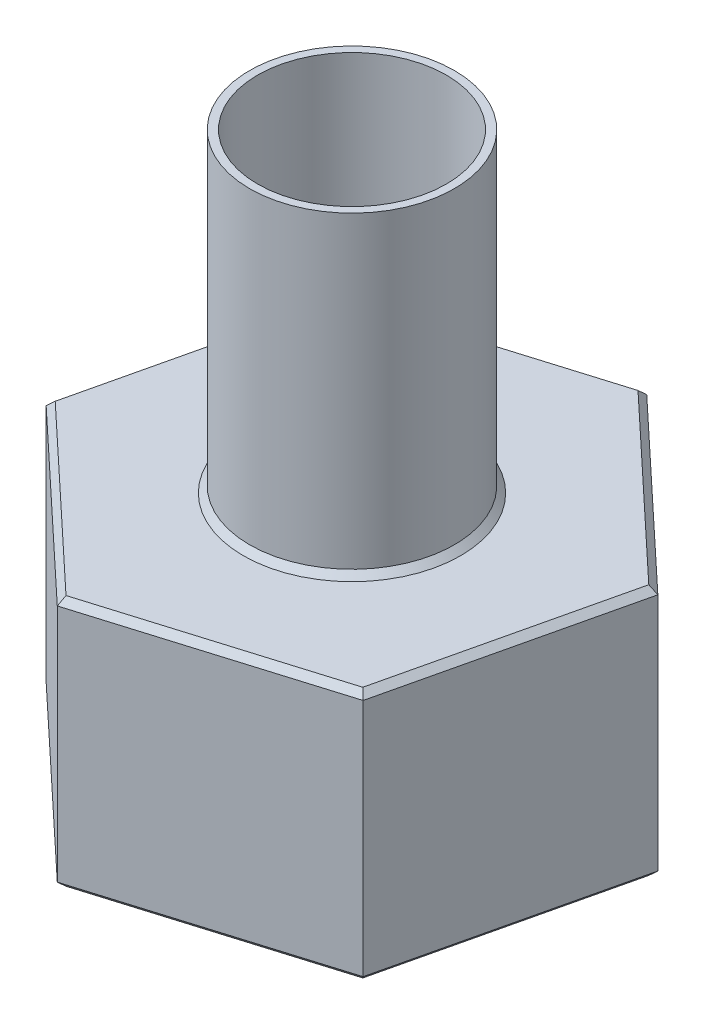
ISO-10303-21;
HEADER;
FILE_DESCRIPTION(('STEP AP214'),'2;1');
FILE_NAME('part.step','',(''),(''),'','','');
FILE_SCHEMA(('AUTOMOTIVE_DESIGN { 1 0 10303 214 1 1 1 1 }'));
ENDSEC;
DATA;
#1=APPLICATION_CONTEXT('core data for automotive mechanical design processes');
#2=APPLICATION_PROTOCOL_DEFINITION('international standard','automotive_design',2000,#1);
#3=PRODUCT_CONTEXT('',#1,'mechanical');
#4=PRODUCT('Part','Part','',(#3));
#5=PRODUCT_RELATED_PRODUCT_CATEGORY('part','',(#4));
#6=PRODUCT_DEFINITION_FORMATION('','',#4);
#7=PRODUCT_DEFINITION_CONTEXT('part definition',#1,'design');
#8=PRODUCT_DEFINITION('design','',#6,#7);
#9=PRODUCT_DEFINITION_SHAPE('','',#8);
#10=(LENGTH_UNIT() NAMED_UNIT(*) SI_UNIT(.MILLI.,.METRE.));
#11=(NAMED_UNIT(*) PLANE_ANGLE_UNIT() SI_UNIT($,.RADIAN.));
#12=(NAMED_UNIT(*) SI_UNIT($,.STERADIAN.) SOLID_ANGLE_UNIT());
#13=UNCERTAINTY_MEASURE_WITH_UNIT(LENGTH_MEASURE(1.E-05),#10,'distance_accuracy_value','');
#14=(GEOMETRIC_REPRESENTATION_CONTEXT(3) GLOBAL_UNCERTAINTY_ASSIGNED_CONTEXT((#13)) GLOBAL_UNIT_ASSIGNED_CONTEXT((#10,
#11,#12)) REPRESENTATION_CONTEXT('',''));
#15=CARTESIAN_POINT('',(0.,0.,0.));
#16=DIRECTION('',(0.,0.,1.));
#17=DIRECTION('',(1.,0.,0.));
#18=AXIS2_PLACEMENT_3D('',#15,#16,#17);
#19=CARTESIAN_POINT('',(0.,18.513068084755,0.));
#20=DIRECTION('',(0.,-1.,0.));
#21=DIRECTION('',(0.,0.,-1.));
#22=AXIS2_PLACEMENT_3D('',#19,#20,#21);
#23=CYLINDRICAL_SURFACE('',#22,5.54214814568497);
#24=CARTESIAN_POINT('',(0.,1.81677179587929,0.));
#25=DIRECTION('',(0.,-1.,0.));
#26=DIRECTION('',(0.,0.,-1.));
#27=AXIS2_PLACEMENT_3D('',#24,#25,#26);
#28=CIRCLE('',#27,5.54214814568497);
#29=CARTESIAN_POINT('',(0.,1.81677179587929,-5.54214814568497));
#30=VERTEX_POINT('',#29);
#31=EDGE_CURVE('E206',#30,#30,#28,.F.);
#32=ORIENTED_EDGE('',*,*,#31,.T.);
#33=EDGE_LOOP('',(#32));
#34=FACE_BOUND('',#33,.T.);
#35=CARTESIAN_POINT('',(0.,18.513068084755,0.));
#36=DIRECTION('',(0.,1.,0.));
#37=DIRECTION('',(0.,0.,1.));
#38=AXIS2_PLACEMENT_3D('',#35,#36,#37);
#39=CIRCLE('',#38,5.54214814568497);
#40=CARTESIAN_POINT('',(0.,18.513068084755,5.54214814568497));
#41=VERTEX_POINT('',#40);
#42=EDGE_CURVE('E165',#41,#41,#39,.T.);
#43=ORIENTED_EDGE('',*,*,#42,.F.);
#44=EDGE_LOOP('',(#43));
#45=FACE_BOUND('',#44,.T.);
#46=ADVANCED_FACE('F40',(#34,#45),#23,.T.);
#47=CARTESIAN_POINT('',(0.,18.513068084755,0.));
#48=DIRECTION('',(0.,1.,0.));
#49=DIRECTION('',(0.,0.,1.));
#50=AXIS2_PLACEMENT_3D('',#47,#48,#49);
#51=PLANE('',#50);
#52=CARTESIAN_POINT('',(0.,18.513068084755,0.));
#53=DIRECTION('',(0.,-1.,0.));
#54=DIRECTION('',(0.,0.,-1.));
#55=AXIS2_PLACEMENT_3D('',#52,#53,#54);
#56=CIRCLE('',#55,5.11111110883951);
#57=CARTESIAN_POINT('',(0.,18.513068084755,-5.11111110883951));
#58=VERTEX_POINT('',#57);
#59=EDGE_CURVE('E170',#58,#58,#56,.T.);
#60=ORIENTED_EDGE('',*,*,#59,.T.);
#61=EDGE_LOOP('',(#60));
#62=FACE_BOUND('',#61,.T.);
#63=ORIENTED_EDGE('',*,*,#42,.T.);
#64=EDGE_LOOP('',(#63));
#65=FACE_BOUND('',#64,.T.);
#66=ADVANCED_FACE('F293',(#62,#65),#51,.T.);
#67=CARTESIAN_POINT('',(0.,18.513068084755,0.));
#68=DIRECTION('',(0.,-1.,0.));
#69=DIRECTION('',(0.,0.,-1.));
#70=AXIS2_PLACEMENT_3D('',#67,#68,#69);
#71=CYLINDRICAL_SURFACE('',#70,5.11111110883951);
#72=ORIENTED_EDGE('',*,*,#59,.F.);
#73=EDGE_LOOP('',(#72));
#74=FACE_BOUND('',#73,.T.);
#75=CARTESIAN_POINT('',(0.,1.47603105529,0.));
#76=DIRECTION('',(0.,-1.,0.));
#77=DIRECTION('',(0.,0.,-1.));
#78=AXIS2_PLACEMENT_3D('',#75,#76,#77);
#79=CIRCLE('',#78,5.11111110883951);
#80=CARTESIAN_POINT('',(0.,1.47603105529,-5.11111110883951));
#81=VERTEX_POINT('',#80);
#82=EDGE_CURVE('E265',#81,#81,#79,.T.);
#83=ORIENTED_EDGE('',*,*,#82,.T.);
#84=EDGE_LOOP('',(#83));
#85=FACE_BOUND('',#84,.T.);
#86=ADVANCED_FACE('F270',(#74,#85),#71,.F.);
#87=CARTESIAN_POINT('',(0.,1.47603105529,0.));
#88=DIRECTION('',(0.,-1.,0.));
#89=DIRECTION('',(0.,0.,-1.));
#90=AXIS2_PLACEMENT_3D('',#87,#88,#89);
#91=PLANE('',#90);
#92=DIRECTION('',(0.227681487376882,0.,-0.973735662439171));
#93=VECTOR('',#92,1.);
#94=CARTESIAN_POINT('',(10.8661687023159,1.47603105529,2.54075674504318));
#95=LINE('',#94,#93);
#96=CARTESIAN_POINT('',(9.39926211161985,1.47603105529,8.81434217038515));
#97=VERTEX_POINT('',#96);
#98=CARTESIAN_POINT('',(12.3330752930119,1.47603105529,-3.73282868029879));
#99=VERTEX_POINT('',#98);
#100=EDGE_CURVE('E184',#97,#99,#95,.T.);
#101=ORIENTED_EDGE('',*,*,#100,.T.);
#102=DIRECTION('',(-0.729439076554749,0.,-0.684045783259392));
#103=VECTOR('',#102,1.);
#104=CARTESIAN_POINT('',(7.633444237202,1.47603105529,-8.13999976549136));
#105=LINE('',#104,#103);
#106=CARTESIAN_POINT('',(2.93381318139207,1.47603105529,-12.5471708506839));
#107=VERTEX_POINT('',#106);
#108=EDGE_CURVE('E143',#99,#107,#105,.T.);
#109=ORIENTED_EDGE('',*,*,#108,.T.);
#110=DIRECTION('',(-0.957120563931632,0.,0.289689879179779));
#111=VECTOR('',#110,1.);
#112=CARTESIAN_POINT('',(-3.23272446511389,1.47603105529,-10.6807565105345));
#113=LINE('',#112,#111);
#114=CARTESIAN_POINT('',(-9.39926211161985,1.47603105529,-8.81434217038514));
#115=VERTEX_POINT('',#114);
#116=EDGE_CURVE('E176',#107,#115,#113,.T.);
#117=ORIENTED_EDGE('',*,*,#116,.T.);
#118=DIRECTION('',(-0.227681487376882,0.,0.973735662439171));
#119=VECTOR('',#118,1.);
#120=CARTESIAN_POINT('',(-10.8661687023159,1.47603105529,-2.54075674504318));
#121=LINE('',#120,#119);
#122=CARTESIAN_POINT('',(-12.3330752930119,1.47603105529,3.73282868029878));
#123=VERTEX_POINT('',#122);
#124=EDGE_CURVE('E178',#115,#123,#121,.T.);
#125=ORIENTED_EDGE('',*,*,#124,.T.);
#126=DIRECTION('',(0.729439076554749,0.,0.684045783259392));
#127=VECTOR('',#126,1.);
#128=CARTESIAN_POINT('',(-7.633444237202,1.47603105529,8.13999976549136));
#129=LINE('',#128,#127);
#130=CARTESIAN_POINT('',(-2.93381318139207,1.47603105529,12.5471708506839));
#131=VERTEX_POINT('',#130);
#132=EDGE_CURVE('E180',#123,#131,#129,.T.);
#133=ORIENTED_EDGE('',*,*,#132,.T.);
#134=DIRECTION('',(0.957120563931632,0.,-0.289689879179779));
#135=VECTOR('',#134,1.);
#136=CARTESIAN_POINT('',(3.23272446511389,1.47603105529,10.6807565105345));
#137=LINE('',#136,#135);
#138=EDGE_CURVE('E182',#131,#97,#137,.T.);
#139=ORIENTED_EDGE('',*,*,#138,.T.);
#140=EDGE_LOOP('',(#101,#109,#117,#125,#133,#139));
#141=FACE_BOUND('',#140,.T.);
#142=CARTESIAN_POINT('',(0.,1.47603105529,0.));
#143=DIRECTION('',(0.,-1.,0.));
#144=DIRECTION('',(0.,0.,-1.));
#145=AXIS2_PLACEMENT_3D('',#142,#143,#144);
#146=CIRCLE('',#145,5.88288888627426);
#147=CARTESIAN_POINT('',(0.,1.47603105529,-5.88288888627426));
#148=VERTEX_POINT('',#147);
#149=EDGE_CURVE('E167',#148,#148,#146,.T.);
#150=ORIENTED_EDGE('',*,*,#149,.T.);
#151=EDGE_LOOP('',(#150));
#152=FACE_BOUND('',#151,.T.);
#153=ADVANCED_FACE('F277',(#141,#152),#91,.F.);
#154=CARTESIAN_POINT('',(0.,-12.153598568282,0.));
#155=DIRECTION('',(0.,-1.,0.));
#156=DIRECTION('',(0.,0.,-1.));
#157=AXIS2_PLACEMENT_3D('',#154,#155,#156);
#158=PLANE('',#157);
#159=CARTESIAN_POINT('',(0.,-12.153598568282,0.));
#160=DIRECTION('',(0.,-1.,0.));
#161=DIRECTION('',(0.,0.,-1.));
#162=AXIS2_PLACEMENT_3D('',#159,#160,#161);
#163=CIRCLE('',#162,10.8185185137103);
#164=CARTESIAN_POINT('',(0.,-12.153598568282,-10.8185185137103));
#165=VERTEX_POINT('',#164);
#166=EDGE_CURVE('E475',#165,#165,#163,.T.);
#167=ORIENTED_EDGE('',*,*,#166,.F.);
#168=EDGE_LOOP('',(#167));
#169=FACE_BOUND('',#168,.T.);
#170=DIRECTION('',(0.227681487376882,0.,-0.973735662439171));
#171=VECTOR('',#170,1.);
#172=CARTESIAN_POINT('',(-9.35447107068257,-12.153598568282,-9.00590203070093));
#173=LINE('',#172,#171);
#174=CARTESIAN_POINT('',(-12.3330752930119,-12.153598568282,3.73282868029878));
#175=VERTEX_POINT('',#174);
#176=CARTESIAN_POINT('',(-9.39926211161985,-12.153598568282,-8.81434217038514));
#177=VERTEX_POINT('',#176);
#178=EDGE_CURVE('E209',#175,#177,#173,.T.);
#179=ORIENTED_EDGE('',*,*,#178,.T.);
#180=DIRECTION('',(0.957120563931632,0.,-0.289689879179779));
#181=VECTOR('',#180,1.);
#182=CARTESIAN_POINT('',(3.12210440723958,-12.153598568282,-12.6041606015282));
#183=LINE('',#182,#181);
#184=CARTESIAN_POINT('',(2.93381318139207,-12.153598568282,-12.5471708506839));
#185=VERTEX_POINT('',#184);
#186=EDGE_CURVE('E11',#177,#185,#183,.T.);
#187=ORIENTED_EDGE('',*,*,#186,.T.);
#188=DIRECTION('',(0.729439076554749,0.,0.684045783259392));
#189=VECTOR('',#188,1.);
#190=CARTESIAN_POINT('',(12.4765754779221,-12.153598568282,-3.59825857082726));
#191=LINE('',#190,#189);
#192=CARTESIAN_POINT('',(12.3330752930119,-12.153598568282,-3.73282868029879));
#193=VERTEX_POINT('',#192);
#194=EDGE_CURVE('E49',#185,#193,#191,.T.);
#195=ORIENTED_EDGE('',*,*,#194,.T.);
#196=DIRECTION('',(-0.227681487376882,0.,0.973735662439171));
#197=VECTOR('',#196,1.);
#198=CARTESIAN_POINT('',(9.35447107068257,-12.153598568282,9.00590203070093));
#199=LINE('',#198,#197);
#200=CARTESIAN_POINT('',(9.39926211161985,-12.153598568282,8.81434217038514));
#201=VERTEX_POINT('',#200);
#202=EDGE_CURVE('E159',#193,#201,#199,.T.);
#203=ORIENTED_EDGE('',*,*,#202,.T.);
#204=DIRECTION('',(-0.957120563931632,0.,0.289689879179779));
#205=VECTOR('',#204,1.);
#206=CARTESIAN_POINT('',(-3.12210440723958,-12.153598568282,12.6041606015282));
#207=LINE('',#206,#205);
#208=CARTESIAN_POINT('',(-2.93381318139207,-12.153598568282,12.5471708506839));
#209=VERTEX_POINT('',#208);
#210=EDGE_CURVE('E213',#201,#209,#207,.T.);
#211=ORIENTED_EDGE('',*,*,#210,.T.);
#212=DIRECTION('',(-0.729439076554749,0.,-0.684045783259392));
#213=VECTOR('',#212,1.);
#214=CARTESIAN_POINT('',(-12.4765754779221,-12.153598568282,3.59825857082726));
#215=LINE('',#214,#213);
#216=EDGE_CURVE('E211',#209,#175,#215,.T.);
#217=ORIENTED_EDGE('',*,*,#216,.T.);
#218=EDGE_LOOP('',(#179,#187,#195,#203,#211,#217));
#219=FACE_BOUND('',#218,.T.);
#220=ADVANCED_FACE('F290',(#169,#219),#158,.T.);
#221=CARTESIAN_POINT('',(-12.7096577447069,-12.153598568282,3.8468081819873));
#222=DIRECTION('',(0.973735662439171,0.,0.227681487376882));
#223=DIRECTION('',(0.227681487376882,0.,-0.973735662439171));
#224=AXIS2_PLACEMENT_3D('',#221,#222,#223);
#225=PLANE('',#224);
#226=DIRECTION('',(0.,1.,0.));
#227=VECTOR('',#226,1.);
#228=CARTESIAN_POINT('',(-12.7096577447069,-12.153598568282,3.8468081819873));
#229=LINE('',#228,#227);
#230=CARTESIAN_POINT('',(-12.7096577447069,-11.8128578276927,3.8468081819873));
#231=VERTEX_POINT('',#230);
#232=CARTESIAN_POINT('',(-12.7096577447069,1.1352903147007,3.8468081819873));
#233=VERTEX_POINT('',#232);
#234=EDGE_CURVE('E257',#231,#233,#229,.T.);
#235=ORIENTED_EDGE('',*,*,#234,.T.);
#236=DIRECTION('',(0.227681487376882,0.,-0.973735662439171));
#237=VECTOR('',#236,1.);
#238=CARTESIAN_POINT('',(-12.7096577447069,1.1352903147007,3.8468081819873));
#239=LINE('',#238,#237);
#240=CARTESIAN_POINT('',(-9.6862624814403,1.1352903147007,-9.0834823893282));
#241=VERTEX_POINT('',#240);
#242=EDGE_CURVE('E199',#233,#241,#239,.T.);
#243=ORIENTED_EDGE('',*,*,#242,.T.);
#244=DIRECTION('',(0.,1.,0.));
#245=VECTOR('',#244,1.);
#246=CARTESIAN_POINT('',(-9.6862624814403,-12.153598568282,-9.0834823893282));
#247=LINE('',#246,#245);
#248=CARTESIAN_POINT('',(-9.6862624814403,-11.8128578276927,-9.0834823893282));
#249=VERTEX_POINT('',#248);
#250=EDGE_CURVE('E233',#249,#241,#247,.T.);
#251=ORIENTED_EDGE('',*,*,#250,.F.);
#252=DIRECTION('',(-0.227681487376882,0.,0.973735662439171));
#253=VECTOR('',#252,1.);
#254=CARTESIAN_POINT('',(-12.7096577447069,-11.8128578276927,3.8468081819873));
#255=LINE('',#254,#253);
#256=EDGE_CURVE('E197',#249,#231,#255,.T.);
#257=ORIENTED_EDGE('',*,*,#256,.T.);
#258=EDGE_LOOP('',(#235,#243,#251,#257));
#259=FACE_BOUND('',#258,.T.);
#260=ADVANCED_FACE('F416',(#259),#225,.F.);
#261=CARTESIAN_POINT('',(-3.02339526326664,-12.153598568282,12.9302905713155));
#262=DIRECTION('',(0.684045783259392,0.,-0.729439076554749));
#263=DIRECTION('',(-0.729439076554749,0.,-0.684045783259392));
#264=AXIS2_PLACEMENT_3D('',#261,#262,#263);
#265=PLANE('',#264);
#266=DIRECTION('',(0.,1.,0.));
#267=VECTOR('',#266,1.);
#268=CARTESIAN_POINT('',(-3.02339526326664,-12.153598568282,12.9302905713155));
#269=LINE('',#268,#267);
#270=CARTESIAN_POINT('',(-3.02339526326664,-11.8128578276927,12.9302905713155));
#271=VERTEX_POINT('',#270);
#272=CARTESIAN_POINT('',(-3.02339526326664,1.1352903147007,12.9302905713155));
#273=VERTEX_POINT('',#272);
#274=EDGE_CURVE('E254',#271,#273,#269,.T.);
#275=ORIENTED_EDGE('',*,*,#274,.T.);
#276=DIRECTION('',(-0.729439076554749,0.,-0.684045783259392));
#277=VECTOR('',#276,1.);
#278=CARTESIAN_POINT('',(-3.02339526326664,1.1352903147007,12.9302905713155));
#279=LINE('',#278,#277);
#280=EDGE_CURVE('E195',#273,#233,#279,.T.);
#281=ORIENTED_EDGE('',*,*,#280,.T.);
#282=ORIENTED_EDGE('',*,*,#234,.F.);
#283=DIRECTION('',(0.729439076554749,0.,0.684045783259392));
#284=VECTOR('',#283,1.);
#285=CARTESIAN_POINT('',(-3.02339526326664,-11.8128578276927,12.9302905713155));
#286=LINE('',#285,#284);
#287=EDGE_CURVE('E193',#231,#271,#286,.T.);
#288=ORIENTED_EDGE('',*,*,#287,.T.);
#289=EDGE_LOOP('',(#275,#281,#282,#288));
#290=FACE_BOUND('',#289,.T.);
#291=ADVANCED_FACE('F407',(#290),#265,.F.);
#292=CARTESIAN_POINT('',(9.6862624814403,-12.153598568282,9.0834823893282));
#293=DIRECTION('',(-0.289689879179779,0.,-0.957120563931632));
#294=DIRECTION('',(-0.957120563931632,0.,0.289689879179779));
#295=AXIS2_PLACEMENT_3D('',#292,#293,#294);
#296=PLANE('',#295);
#297=DIRECTION('',(0.,1.,0.));
#298=VECTOR('',#297,1.);
#299=CARTESIAN_POINT('',(9.6862624814403,-12.153598568282,9.0834823893282));
#300=LINE('',#299,#298);
#301=CARTESIAN_POINT('',(9.6862624814403,-11.8128578276927,9.0834823893282));
#302=VERTEX_POINT('',#301);
#303=CARTESIAN_POINT('',(9.6862624814403,1.1352903147007,9.0834823893282));
#304=VERTEX_POINT('',#303);
#305=EDGE_CURVE('E137',#302,#304,#300,.T.);
#306=ORIENTED_EDGE('',*,*,#305,.T.);
#307=DIRECTION('',(-0.957120563931632,0.,0.289689879179779));
#308=VECTOR('',#307,1.);
#309=CARTESIAN_POINT('',(9.6862624814403,1.1352903147007,9.0834823893282));
#310=LINE('',#309,#308);
#311=EDGE_CURVE('E191',#304,#273,#310,.T.);
#312=ORIENTED_EDGE('',*,*,#311,.T.);
#313=ORIENTED_EDGE('',*,*,#274,.F.);
#314=DIRECTION('',(0.957120563931632,0.,-0.289689879179779));
#315=VECTOR('',#314,1.);
#316=CARTESIAN_POINT('',(9.6862624814403,-11.8128578276927,9.0834823893282));
#317=LINE('',#316,#315);
#318=EDGE_CURVE('E189',#271,#302,#317,.T.);
#319=ORIENTED_EDGE('',*,*,#318,.T.);
#320=EDGE_LOOP('',(#306,#312,#313,#319));
#321=FACE_BOUND('',#320,.T.);
#322=ADVANCED_FACE('F251',(#321),#296,.F.);
#323=CARTESIAN_POINT('',(12.7096577447069,-12.153598568282,-3.8468081819873));
#324=DIRECTION('',(-0.973735662439171,0.,-0.227681487376882));
#325=DIRECTION('',(-0.227681487376882,0.,0.973735662439171));
#326=AXIS2_PLACEMENT_3D('',#323,#324,#325);
#327=PLANE('',#326);
#328=DIRECTION('',(0.,1.,0.));
#329=VECTOR('',#328,1.);
#330=CARTESIAN_POINT('',(12.7096577447069,-12.153598568282,-3.8468081819873));
#331=LINE('',#330,#329);
#332=CARTESIAN_POINT('',(12.7096577447069,-11.8128578276927,-3.8468081819873));
#333=VERTEX_POINT('',#332);
#334=CARTESIAN_POINT('',(12.7096577447069,1.1352903147007,-3.8468081819873));
#335=VERTEX_POINT('',#334);
#336=EDGE_CURVE('E135',#333,#335,#331,.T.);
#337=ORIENTED_EDGE('',*,*,#336,.T.);
#338=DIRECTION('',(-0.227681487376882,0.,0.973735662439171));
#339=VECTOR('',#338,1.);
#340=CARTESIAN_POINT('',(12.7096577447069,1.1352903147007,-3.8468081819873));
#341=LINE('',#340,#339);
#342=EDGE_CURVE('E142',#335,#304,#341,.T.);
#343=ORIENTED_EDGE('',*,*,#342,.T.);
#344=ORIENTED_EDGE('',*,*,#305,.F.);
#345=DIRECTION('',(0.227681487376882,0.,-0.973735662439171));
#346=VECTOR('',#345,1.);
#347=CARTESIAN_POINT('',(12.7096577447069,-11.8128578276927,-3.8468081819873));
#348=LINE('',#347,#346);
#349=EDGE_CURVE('E132',#302,#333,#348,.T.);
#350=ORIENTED_EDGE('',*,*,#349,.T.);
#351=EDGE_LOOP('',(#337,#343,#344,#350));
#352=FACE_BOUND('',#351,.T.);
#353=ADVANCED_FACE('F134',(#352),#327,.F.);
#354=CARTESIAN_POINT('',(3.02339526326664,-12.153598568282,-12.9302905713155));
#355=DIRECTION('',(-0.684045783259392,0.,0.729439076554749));
#356=DIRECTION('',(0.729439076554749,0.,0.684045783259392));
#357=AXIS2_PLACEMENT_3D('',#354,#355,#356);
#358=PLANE('',#357);
#359=DIRECTION('',(0.,1.,0.));
#360=VECTOR('',#359,1.);
#361=CARTESIAN_POINT('',(3.02339526326664,-12.153598568282,-12.9302905713155));
#362=LINE('',#361,#360);
#363=CARTESIAN_POINT('',(3.02339526326664,-11.8128578276927,-12.9302905713155));
#364=VERTEX_POINT('',#363);
#365=CARTESIAN_POINT('',(3.02339526326664,1.1352903147007,-12.9302905713155));
#366=VERTEX_POINT('',#365);
#367=EDGE_CURVE('E154',#364,#366,#362,.T.);
#368=ORIENTED_EDGE('',*,*,#367,.T.);
#369=DIRECTION('',(0.729439076554749,0.,0.684045783259392));
#370=VECTOR('',#369,1.);
#371=CARTESIAN_POINT('',(3.02339526326664,1.1352903147007,-12.9302905713155));
#372=LINE('',#371,#370);
#373=EDGE_CURVE('E153',#366,#335,#372,.T.);
#374=ORIENTED_EDGE('',*,*,#373,.T.);
#375=ORIENTED_EDGE('',*,*,#336,.F.);
#376=DIRECTION('',(-0.729439076554749,0.,-0.684045783259392));
#377=VECTOR('',#376,1.);
#378=CARTESIAN_POINT('',(3.02339526326664,-11.8128578276927,-12.9302905713155));
#379=LINE('',#378,#377);
#380=EDGE_CURVE('E150',#333,#364,#379,.T.);
#381=ORIENTED_EDGE('',*,*,#380,.T.);
#382=EDGE_LOOP('',(#368,#374,#375,#381));
#383=FACE_BOUND('',#382,.T.);
#384=ADVANCED_FACE('F148',(#383),#358,.F.);
#385=CARTESIAN_POINT('',(-9.6862624814403,-12.153598568282,-9.0834823893282));
#386=DIRECTION('',(0.289689879179779,0.,0.957120563931632));
#387=DIRECTION('',(0.957120563931632,0.,-0.289689879179779));
#388=AXIS2_PLACEMENT_3D('',#385,#386,#387);
#389=PLANE('',#388);
#390=ORIENTED_EDGE('',*,*,#250,.T.);
#391=DIRECTION('',(0.957120563931632,0.,-0.289689879179779));
#392=VECTOR('',#391,1.);
#393=CARTESIAN_POINT('',(-9.6862624814403,1.1352903147007,-9.0834823893282));
#394=LINE('',#393,#392);
#395=EDGE_CURVE('E204',#241,#366,#394,.T.);
#396=ORIENTED_EDGE('',*,*,#395,.T.);
#397=ORIENTED_EDGE('',*,*,#367,.F.);
#398=DIRECTION('',(-0.957120563931632,0.,0.289689879179779));
#399=VECTOR('',#398,1.);
#400=CARTESIAN_POINT('',(-9.6862624814403,-11.8128578276927,-9.0834823893282));
#401=LINE('',#400,#399);
#402=EDGE_CURVE('E201',#364,#249,#401,.T.);
#403=ORIENTED_EDGE('',*,*,#402,.T.);
#404=EDGE_LOOP('',(#390,#396,#397,#403));
#405=FACE_BOUND('',#404,.T.);
#406=ADVANCED_FACE('F275',(#405),#389,.F.);
#407=ORIENTED_EDGE('',*,*,#82,.F.);
#408=EDGE_LOOP('',(#407));
#409=FACE_BOUND('',#408,.T.);
#410=ADVANCED_FACE('F272',(#409),#91,.F.);
#411=CARTESIAN_POINT('',(-3.02339526326664,1.1352903147007,12.9302905713155));
#412=DIRECTION('',(0.48369341198478,-0.707106781186547,-0.515791317494317));
#413=DIRECTION('',(-0.729439076554749,0.,-0.684045783259392));
#414=AXIS2_PLACEMENT_3D('',#411,#412,#413);
#415=PLANE('',#414);
#416=DIRECTION('',(0.172111026780724,0.654653670707979,-0.736074973008221));
#417=VECTOR('',#416,1.);
#418=CARTESIAN_POINT('',(-3.02339526326664,1.1352903147007,12.9302905713155));
#419=LINE('',#418,#417);
#420=EDGE_CURVE('E227',#131,#273,#419,.F.);
#421=ORIENTED_EDGE('',*,*,#420,.F.);
#422=ORIENTED_EDGE('',*,*,#132,.F.);
#423=DIRECTION('',(0.723515139105426,0.654653670707978,-0.218984965040585));
#424=VECTOR('',#423,1.);
#425=CARTESIAN_POINT('',(-12.7096577447069,1.1352903147007,3.8468081819873));
#426=LINE('',#425,#424);
#427=EDGE_CURVE('E230',#233,#123,#426,.T.);
#428=ORIENTED_EDGE('',*,*,#427,.F.);
#429=ORIENTED_EDGE('',*,*,#280,.F.);
#430=EDGE_LOOP('',(#421,#422,#428,#429));
#431=FACE_BOUND('',#430,.T.);
#432=ADVANCED_FACE('F274',(#431),#415,.F.);
#433=CARTESIAN_POINT('',(-12.7096577447069,1.1352903147007,3.8468081819873));
#434=DIRECTION('',(0.688535089993914,-0.707106781186546,0.160995123674833));
#435=DIRECTION('',(0.227681487376882,0.,-0.973735662439171));
#436=AXIS2_PLACEMENT_3D('',#433,#434,#435);
#437=PLANE('',#436);
#438=ORIENTED_EDGE('',*,*,#427,.T.);
#439=ORIENTED_EDGE('',*,*,#124,.F.);
#440=DIRECTION('',(0.551404112324704,0.654653670707978,0.517090007967641));
#441=VECTOR('',#440,1.);
#442=CARTESIAN_POINT('',(-9.6862624814403,1.1352903147007,-9.0834823893282));
#443=LINE('',#442,#441);
#444=EDGE_CURVE('E224',#241,#115,#443,.T.);
#445=ORIENTED_EDGE('',*,*,#444,.F.);
#446=ORIENTED_EDGE('',*,*,#242,.F.);
#447=EDGE_LOOP('',(#438,#439,#445,#446));
#448=FACE_BOUND('',#447,.T.);
#449=ADVANCED_FACE('F282',(#448),#437,.F.);
#450=CARTESIAN_POINT('',(9.6862624814403,1.1352903147007,9.0834823893282));
#451=DIRECTION('',(-0.204841678009134,-0.707106781186545,-0.676786441169152));
#452=DIRECTION('',(-0.957120563931632,0.,0.289689879179779));
#453=AXIS2_PLACEMENT_3D('',#450,#451,#452);
#454=PLANE('',#453);
#455=ORIENTED_EDGE('',*,*,#420,.T.);
#456=ORIENTED_EDGE('',*,*,#311,.F.);
#457=DIRECTION('',(-0.551404112324706,0.65465367070798,-0.517090007967637));
#458=VECTOR('',#457,1.);
#459=CARTESIAN_POINT('',(9.6862624814403,1.1352903147007,9.0834823893282));
#460=LINE('',#459,#458);
#461=EDGE_CURVE('E221',#97,#304,#460,.F.);
#462=ORIENTED_EDGE('',*,*,#461,.F.);
#463=ORIENTED_EDGE('',*,*,#138,.F.);
#464=EDGE_LOOP('',(#455,#456,#462,#463));
#465=FACE_BOUND('',#464,.T.);
#466=ADVANCED_FACE('F316',(#465),#454,.F.);
#467=CARTESIAN_POINT('',(-9.6862624814403,1.1352903147007,-9.0834823893282));
#468=DIRECTION('',(0.204841678009134,-0.707106781186547,0.67678644116915));
#469=DIRECTION('',(0.957120563931632,0.,-0.289689879179779));
#470=AXIS2_PLACEMENT_3D('',#467,#468,#469);
#471=PLANE('',#470);
#472=ORIENTED_EDGE('',*,*,#444,.T.);
#473=ORIENTED_EDGE('',*,*,#116,.F.);
#474=DIRECTION('',(0.172111026780718,-0.654653670707978,-0.736074973008224));
#475=VECTOR('',#474,1.);
#476=CARTESIAN_POINT('',(2.15956804519048,4.42100459895466,-9.23592183665396));
#477=LINE('',#476,#475);
#478=EDGE_CURVE('E219',#366,#107,#477,.F.);
#479=ORIENTED_EDGE('',*,*,#478,.F.);
#480=ORIENTED_EDGE('',*,*,#395,.F.);
#481=EDGE_LOOP('',(#472,#473,#479,#480));
#482=FACE_BOUND('',#481,.T.);
#483=ADVANCED_FACE('F312',(#482),#471,.F.);
#484=CARTESIAN_POINT('',(12.7096577447069,1.1352903147007,-3.8468081819873));
#485=DIRECTION('',(-0.688535089993914,-0.707106781186546,-0.160995123674833));
#486=DIRECTION('',(-0.227681487376882,0.,0.973735662439171));
#487=AXIS2_PLACEMENT_3D('',#484,#485,#486);
#488=PLANE('',#487);
#489=ORIENTED_EDGE('',*,*,#461,.T.);
#490=ORIENTED_EDGE('',*,*,#342,.F.);
#491=DIRECTION('',(-0.723515139105426,0.654653670707979,0.218984965040583));
#492=VECTOR('',#491,1.);
#493=CARTESIAN_POINT('',(12.7096577447069,1.1352903147007,-3.8468081819873));
#494=LINE('',#493,#492);
#495=EDGE_CURVE('E217',#99,#335,#494,.F.);
#496=ORIENTED_EDGE('',*,*,#495,.F.);
#497=ORIENTED_EDGE('',*,*,#100,.F.);
#498=EDGE_LOOP('',(#489,#490,#496,#497));
#499=FACE_BOUND('',#498,.T.);
#500=ADVANCED_FACE('F308',(#499),#488,.F.);
#501=CARTESIAN_POINT('',(3.02339526326664,1.1352903147007,-12.9302905713155));
#502=DIRECTION('',(-0.48369341198478,-0.707106781186546,0.515791317494318));
#503=DIRECTION('',(0.729439076554749,0.,0.684045783259392));
#504=AXIS2_PLACEMENT_3D('',#501,#502,#503);
#505=PLANE('',#504);
#506=ORIENTED_EDGE('',*,*,#478,.T.);
#507=ORIENTED_EDGE('',*,*,#108,.F.);
#508=ORIENTED_EDGE('',*,*,#495,.T.);
#509=ORIENTED_EDGE('',*,*,#373,.F.);
#510=EDGE_LOOP('',(#506,#507,#508,#509));
#511=FACE_BOUND('',#510,.T.);
#512=ADVANCED_FACE('F304',(#511),#505,.F.);
#513=CARTESIAN_POINT('',(0.,1.81677179587929,0.));
#514=DIRECTION('',(0.,-1.,0.));
#515=DIRECTION('',(0.,0.,-1.));
#516=AXIS2_PLACEMENT_3D('',#513,#514,#515);
#517=CONICAL_SURFACE('',#516,5.54214814568497,0.785398163397445);
#518=ORIENTED_EDGE('',*,*,#149,.F.);
#519=EDGE_LOOP('',(#518));
#520=FACE_BOUND('',#519,.T.);
#521=ORIENTED_EDGE('',*,*,#31,.F.);
#522=EDGE_LOOP('',(#521));
#523=FACE_BOUND('',#522,.T.);
#524=ADVANCED_FACE('F307',(#520,#523),#517,.T.);
#525=CARTESIAN_POINT('',(3.23272446511389,-12.153598568282,10.6807565105345));
#526=DIRECTION('',(0.204841678009134,-0.707106781186545,0.676786441169152));
#527=DIRECTION('',(0.957120563931632,0.,-0.289689879179779));
#528=AXIS2_PLACEMENT_3D('',#525,#526,#527);
#529=PLANE('',#528);
#530=DIRECTION('',(0.551404112324706,0.65465367070798,0.517090007967637));
#531=VECTOR('',#530,1.);
#532=CARTESIAN_POINT('',(8.05651038138844,-13.7477784617534,7.5551504317587));
#533=LINE('',#532,#531);
#534=EDGE_CURVE('E238',#302,#201,#533,.F.);
#535=ORIENTED_EDGE('',*,*,#534,.F.);
#536=ORIENTED_EDGE('',*,*,#318,.F.);
#537=DIRECTION('',(-0.172111026780724,0.654653670707979,0.736074973008221));
#538=VECTOR('',#537,1.);
#539=CARTESIAN_POINT('',(-2.51469701262177,-13.7477784617534,10.7547178720148));
#540=LINE('',#539,#538);
#541=EDGE_CURVE('E44',#209,#271,#540,.T.);
#542=ORIENTED_EDGE('',*,*,#541,.F.);
#543=ORIENTED_EDGE('',*,*,#210,.F.);
#544=EDGE_LOOP('',(#535,#536,#542,#543));
#545=FACE_BOUND('',#544,.T.);
#546=ADVANCED_FACE('F42',(#545),#529,.T.);
#547=CARTESIAN_POINT('',(-7.633444237202,-12.153598568282,8.13999976549136));
#548=DIRECTION('',(-0.48369341198478,-0.707106781186547,0.515791317494317));
#549=DIRECTION('',(0.729439076554749,0.,0.684045783259392));
#550=AXIS2_PLACEMENT_3D('',#547,#548,#549);
#551=PLANE('',#550);
#552=ORIENTED_EDGE('',*,*,#541,.T.);
#553=ORIENTED_EDGE('',*,*,#287,.F.);
#554=DIRECTION('',(-0.723515139105426,0.654653670707978,0.218984965040585));
#555=VECTOR('',#554,1.);
#556=CARTESIAN_POINT('',(-10.5712073940102,-13.7477784617534,3.1995674402561));
#557=LINE('',#556,#555);
#558=EDGE_CURVE('E161',#175,#231,#557,.T.);
#559=ORIENTED_EDGE('',*,*,#558,.F.);
#560=ORIENTED_EDGE('',*,*,#216,.F.);
#561=EDGE_LOOP('',(#552,#553,#559,#560));
#562=FACE_BOUND('',#561,.T.);
#563=ADVANCED_FACE('F244',(#562),#551,.T.);
#564=CARTESIAN_POINT('',(10.8661687023159,-12.153598568282,2.54075674504318));
#565=DIRECTION('',(0.688535089993914,-0.707106781186546,0.160995123674833));
#566=DIRECTION('',(0.227681487376882,0.,-0.973735662439171));
#567=AXIS2_PLACEMENT_3D('',#564,#565,#566);
#568=PLANE('',#567);
#569=ORIENTED_EDGE('',*,*,#534,.T.);
#570=ORIENTED_EDGE('',*,*,#202,.F.);
#571=DIRECTION('',(0.723515139105426,0.654653670707979,-0.218984965040583));
#572=VECTOR('',#571,1.);
#573=CARTESIAN_POINT('',(10.5712073940102,-13.7477784617534,-3.19956744025611));
#574=LINE('',#573,#572);
#575=EDGE_CURVE('E157',#333,#193,#574,.F.);
#576=ORIENTED_EDGE('',*,*,#575,.F.);
#577=ORIENTED_EDGE('',*,*,#349,.F.);
#578=EDGE_LOOP('',(#569,#570,#576,#577));
#579=FACE_BOUND('',#578,.T.);
#580=ADVANCED_FACE('F158',(#579),#568,.T.);
#581=CARTESIAN_POINT('',(-10.8661687023159,-12.153598568282,-2.54075674504318));
#582=DIRECTION('',(-0.688535089993914,-0.707106781186546,-0.160995123674833));
#583=DIRECTION('',(-0.227681487376882,0.,0.973735662439171));
#584=AXIS2_PLACEMENT_3D('',#581,#582,#583);
#585=PLANE('',#584);
#586=ORIENTED_EDGE('',*,*,#558,.T.);
#587=ORIENTED_EDGE('',*,*,#256,.F.);
#588=DIRECTION('',(0.551404112324704,-0.654653670707978,0.517090007967641));
#589=VECTOR('',#588,1.);
#590=CARTESIAN_POINT('',(-8.05651038138844,-13.7477784617534,-7.55515043175869));
#591=LINE('',#590,#589);
#592=EDGE_CURVE('E162',#177,#249,#591,.F.);
#593=ORIENTED_EDGE('',*,*,#592,.F.);
#594=ORIENTED_EDGE('',*,*,#178,.F.);
#595=EDGE_LOOP('',(#586,#587,#593,#594));
#596=FACE_BOUND('',#595,.T.);
#597=ADVANCED_FACE('F333',(#596),#585,.T.);
#598=CARTESIAN_POINT('',(7.633444237202,-12.153598568282,-8.13999976549136));
#599=DIRECTION('',(0.48369341198478,-0.707106781186546,-0.515791317494318));
#600=DIRECTION('',(-0.729439076554749,0.,-0.684045783259392));
#601=AXIS2_PLACEMENT_3D('',#598,#599,#600);
#602=PLANE('',#601);
#603=ORIENTED_EDGE('',*,*,#575,.T.);
#604=ORIENTED_EDGE('',*,*,#194,.F.);
#605=DIRECTION('',(0.172111026780718,0.654653670707978,-0.736074973008224));
#606=VECTOR('',#605,1.);
#607=CARTESIAN_POINT('',(2.51469701262178,-13.7477784617534,-10.7547178720148));
#608=LINE('',#607,#606);
#609=EDGE_CURVE('E57',#364,#185,#608,.F.);
#610=ORIENTED_EDGE('',*,*,#609,.F.);
#611=ORIENTED_EDGE('',*,*,#380,.F.);
#612=EDGE_LOOP('',(#603,#604,#610,#611));
#613=FACE_BOUND('',#612,.T.);
#614=ADVANCED_FACE('F164',(#613),#602,.T.);
#615=CARTESIAN_POINT('',(-3.23272446511389,-12.153598568282,-10.6807565105345));
#616=DIRECTION('',(-0.204841678009134,-0.707106781186547,-0.67678644116915));
#617=DIRECTION('',(-0.957120563931632,0.,0.289689879179779));
#618=AXIS2_PLACEMENT_3D('',#615,#616,#617);
#619=PLANE('',#618);
#620=ORIENTED_EDGE('',*,*,#592,.T.);
#621=ORIENTED_EDGE('',*,*,#402,.F.);
#622=ORIENTED_EDGE('',*,*,#609,.T.);
#623=ORIENTED_EDGE('',*,*,#186,.F.);
#624=EDGE_LOOP('',(#620,#621,#622,#623));
#625=FACE_BOUND('',#624,.T.);
#626=ADVANCED_FACE('F327',(#625),#619,.T.);
#627=CARTESIAN_POINT('',(0.,0.624179203816751,0.));
#628=DIRECTION('',(0.,-1.,0.));
#629=DIRECTION('',(0.,0.,-1.));
#630=AXIS2_PLACEMENT_3D('',#627,#628,#629);
#631=CYLINDRICAL_SURFACE('',#630,10.8185185137103);
#632=CARTESIAN_POINT('',(0.,0.624179203816751,0.));
#633=DIRECTION('',(0.,-1.,0.));
#634=DIRECTION('',(0.,0.,-1.));
#635=AXIS2_PLACEMENT_3D('',#632,#633,#634);
#636=CIRCLE('',#635,10.8185185137103);
#637=CARTESIAN_POINT('',(0.,0.624179203816751,-10.8185185137103));
#638=VERTEX_POINT('',#637);
#639=EDGE_CURVE('E235',#638,#638,#636,.T.);
#640=ORIENTED_EDGE('',*,*,#639,.F.);
#641=EDGE_LOOP('',(#640));
#642=FACE_BOUND('',#641,.T.);
#643=ORIENTED_EDGE('',*,*,#166,.T.);
#644=EDGE_LOOP('',(#643));
#645=FACE_BOUND('',#644,.T.);
#646=ADVANCED_FACE('F330',(#642,#645),#631,.F.);
#647=CARTESIAN_POINT('',(0.,0.624179203816751,0.));
#648=DIRECTION('',(0.,-1.,0.));
#649=DIRECTION('',(0.,0.,-1.));
#650=AXIS2_PLACEMENT_3D('',#647,#648,#649);
#651=PLANE('',#650);
#652=ORIENTED_EDGE('',*,*,#639,.T.);
#653=EDGE_LOOP('',(#652));
#654=FACE_BOUND('',#653,.T.);
#655=ADVANCED_FACE('F467',(#654),#651,.T.);
#656=CLOSED_SHELL('',(#46,#66,#86,#153,#220,#260,#291,#322,#353,#384,#406,#410,#432,#449,#466,
#483,#500,#512,#524,#546,#563,#580,#597,#614,#626,#646,#655));
#657=MANIFOLD_SOLID_BREP('B2',#656);
#658=ADVANCED_BREP_SHAPE_REPRESENTATION('',(#18,#657),#14);
#659=SHAPE_DEFINITION_REPRESENTATION(#9,#658);
ENDSEC;
END-ISO-10303-21;
